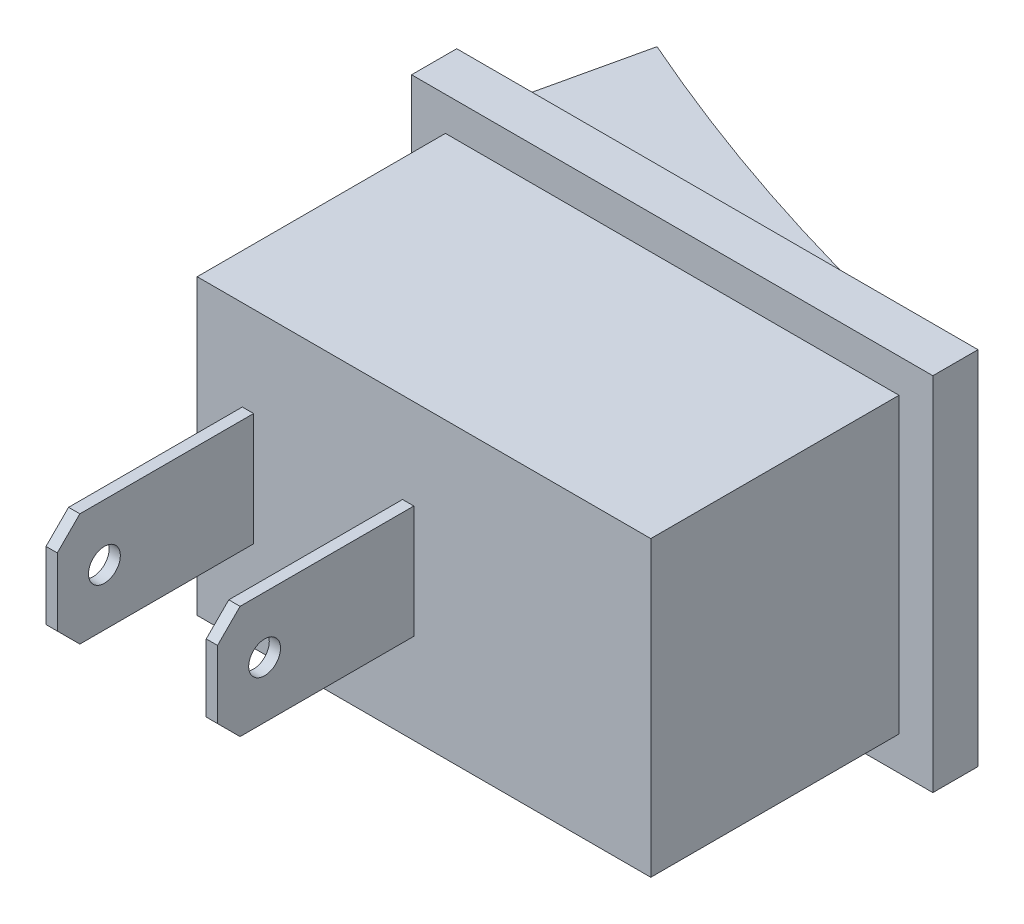
ISO-10303-21;
HEADER;
FILE_DESCRIPTION(('STEP AP214'),'2;1');
FILE_NAME('part.step','',(''),(''),'','','');
FILE_SCHEMA(('AUTOMOTIVE_DESIGN { 1 0 10303 214 1 1 1 1 }'));
ENDSEC;
DATA;
#1=APPLICATION_CONTEXT('core data for automotive mechanical design processes');
#2=APPLICATION_PROTOCOL_DEFINITION('international standard','automotive_design',2000,#1);
#3=PRODUCT_CONTEXT('',#1,'mechanical');
#4=PRODUCT('Part','Part','',(#3));
#5=PRODUCT_RELATED_PRODUCT_CATEGORY('part','',(#4));
#6=PRODUCT_DEFINITION_FORMATION('','',#4);
#7=PRODUCT_DEFINITION_CONTEXT('part definition',#1,'design');
#8=PRODUCT_DEFINITION('design','',#6,#7);
#9=PRODUCT_DEFINITION_SHAPE('','',#8);
#10=(LENGTH_UNIT() NAMED_UNIT(*) SI_UNIT(.MILLI.,.METRE.));
#11=(NAMED_UNIT(*) PLANE_ANGLE_UNIT() SI_UNIT($,.RADIAN.));
#12=(NAMED_UNIT(*) SI_UNIT($,.STERADIAN.) SOLID_ANGLE_UNIT());
#13=UNCERTAINTY_MEASURE_WITH_UNIT(LENGTH_MEASURE(1.E-05),#10,'distance_accuracy_value','');
#14=(GEOMETRIC_REPRESENTATION_CONTEXT(3) GLOBAL_UNCERTAINTY_ASSIGNED_CONTEXT((#13)) GLOBAL_UNIT_ASSIGNED_CONTEXT((#10,
#11,#12)) REPRESENTATION_CONTEXT('',''));
#15=CARTESIAN_POINT('',(0.,0.,0.));
#16=DIRECTION('',(0.,0.,1.));
#17=DIRECTION('',(1.,0.,0.));
#18=AXIS2_PLACEMENT_3D('',#15,#16,#17);
#19=CARTESIAN_POINT('',(0.,0.,11.));
#20=DIRECTION('',(1.,0.,0.));
#21=DIRECTION('',(0.,1.,0.));
#22=AXIS2_PLACEMENT_3D('',#19,#20,#21);
#23=PLANE('',#22);
#24=DIRECTION('',(0.,-1.,0.));
#25=VECTOR('',#24,1.);
#26=CARTESIAN_POINT('',(0.,0.,0.));
#27=LINE('',#26,#25);
#28=CARTESIAN_POINT('',(0.,0.,0.));
#29=VERTEX_POINT('',#28);
#30=CARTESIAN_POINT('',(0.,-13.,0.));
#31=VERTEX_POINT('',#30);
#32=EDGE_CURVE('E295',#29,#31,#27,.T.);
#33=ORIENTED_EDGE('',*,*,#32,.T.);
#34=DIRECTION('',(0.,0.,-1.));
#35=VECTOR('',#34,1.);
#36=CARTESIAN_POINT('',(0.,-13.,11.));
#37=LINE('',#36,#35);
#38=CARTESIAN_POINT('',(0.,-13.,11.));
#39=VERTEX_POINT('',#38);
#40=EDGE_CURVE('E349',#39,#31,#37,.T.);
#41=ORIENTED_EDGE('',*,*,#40,.F.);
#42=DIRECTION('',(0.,-1.,0.));
#43=VECTOR('',#42,1.);
#44=CARTESIAN_POINT('',(0.,0.,11.));
#45=LINE('',#44,#43);
#46=CARTESIAN_POINT('',(0.,0.,11.));
#47=VERTEX_POINT('',#46);
#48=EDGE_CURVE('E320',#47,#39,#45,.T.);
#49=ORIENTED_EDGE('',*,*,#48,.F.);
#50=DIRECTION('',(0.,0.,-1.));
#51=VECTOR('',#50,1.);
#52=CARTESIAN_POINT('',(0.,0.,11.));
#53=LINE('',#52,#51);
#54=EDGE_CURVE('E330',#47,#29,#53,.T.);
#55=ORIENTED_EDGE('',*,*,#54,.T.);
#56=EDGE_LOOP('',(#33,#41,#49,#55));
#57=FACE_BOUND('',#56,.T.);
#58=ADVANCED_FACE('F44',(#57),#23,.F.);
#59=CARTESIAN_POINT('',(0.,-13.,11.));
#60=DIRECTION('',(0.,1.,0.));
#61=DIRECTION('',(0.,0.,1.));
#62=AXIS2_PLACEMENT_3D('',#59,#60,#61);
#63=PLANE('',#62);
#64=DIRECTION('',(1.,0.,0.));
#65=VECTOR('',#64,1.);
#66=CARTESIAN_POINT('',(0.,-13.,0.));
#67=LINE('',#66,#65);
#68=CARTESIAN_POINT('',(20.1,-13.,0.));
#69=VERTEX_POINT('',#68);
#70=EDGE_CURVE('E333',#31,#69,#67,.T.);
#71=ORIENTED_EDGE('',*,*,#70,.T.);
#72=DIRECTION('',(0.,0.,-1.));
#73=VECTOR('',#72,1.);
#74=CARTESIAN_POINT('',(20.1,-13.,11.));
#75=LINE('',#74,#73);
#76=CARTESIAN_POINT('',(20.1,-13.,11.));
#77=VERTEX_POINT('',#76);
#78=EDGE_CURVE('E346',#77,#69,#75,.T.);
#79=ORIENTED_EDGE('',*,*,#78,.F.);
#80=DIRECTION('',(1.,0.,0.));
#81=VECTOR('',#80,1.);
#82=CARTESIAN_POINT('',(0.,-13.,11.));
#83=LINE('',#82,#81);
#84=EDGE_CURVE('E323',#39,#77,#83,.T.);
#85=ORIENTED_EDGE('',*,*,#84,.F.);
#86=ORIENTED_EDGE('',*,*,#40,.T.);
#87=EDGE_LOOP('',(#71,#79,#85,#86));
#88=FACE_BOUND('',#87,.T.);
#89=ADVANCED_FACE('F425',(#88),#63,.F.);
#90=CARTESIAN_POINT('',(20.1,0.,11.));
#91=DIRECTION('',(-1.,0.,0.));
#92=DIRECTION('',(0.,0.,1.));
#93=AXIS2_PLACEMENT_3D('',#90,#91,#92);
#94=PLANE('',#93);
#95=DIRECTION('',(0.,1.,0.));
#96=VECTOR('',#95,1.);
#97=CARTESIAN_POINT('',(20.1,0.,0.));
#98=LINE('',#97,#96);
#99=CARTESIAN_POINT('',(20.1,0.,0.));
#100=VERTEX_POINT('',#99);
#101=EDGE_CURVE('E336',#69,#100,#98,.T.);
#102=ORIENTED_EDGE('',*,*,#101,.T.);
#103=DIRECTION('',(0.,0.,-1.));
#104=VECTOR('',#103,1.);
#105=CARTESIAN_POINT('',(20.1,0.,11.));
#106=LINE('',#105,#104);
#107=CARTESIAN_POINT('',(20.1,0.,11.));
#108=VERTEX_POINT('',#107);
#109=EDGE_CURVE('E343',#108,#100,#106,.T.);
#110=ORIENTED_EDGE('',*,*,#109,.F.);
#111=DIRECTION('',(0.,1.,0.));
#112=VECTOR('',#111,1.);
#113=CARTESIAN_POINT('',(20.1,0.,11.));
#114=LINE('',#113,#112);
#115=EDGE_CURVE('E326',#77,#108,#114,.T.);
#116=ORIENTED_EDGE('',*,*,#115,.F.);
#117=ORIENTED_EDGE('',*,*,#78,.T.);
#118=EDGE_LOOP('',(#102,#110,#116,#117));
#119=FACE_BOUND('',#118,.T.);
#120=ADVANCED_FACE('F431',(#119),#94,.F.);
#121=CARTESIAN_POINT('',(0.,0.,11.));
#122=DIRECTION('',(0.,-1.,0.));
#123=DIRECTION('',(0.,0.,-1.));
#124=AXIS2_PLACEMENT_3D('',#121,#122,#123);
#125=PLANE('',#124);
#126=DIRECTION('',(-1.,0.,0.));
#127=VECTOR('',#126,1.);
#128=CARTESIAN_POINT('',(0.,0.,0.));
#129=LINE('',#128,#127);
#130=EDGE_CURVE('E324',#100,#29,#129,.T.);
#131=ORIENTED_EDGE('',*,*,#130,.T.);
#132=ORIENTED_EDGE('',*,*,#54,.F.);
#133=DIRECTION('',(-1.,0.,0.));
#134=VECTOR('',#133,1.);
#135=CARTESIAN_POINT('',(0.,0.,11.));
#136=LINE('',#135,#134);
#137=EDGE_CURVE('E328',#108,#47,#136,.T.);
#138=ORIENTED_EDGE('',*,*,#137,.F.);
#139=ORIENTED_EDGE('',*,*,#109,.T.);
#140=EDGE_LOOP('',(#131,#132,#138,#139));
#141=FACE_BOUND('',#140,.T.);
#142=ADVANCED_FACE('F497',(#141),#125,.F.);
#143=CARTESIAN_POINT('',(0.,0.,11.));
#144=DIRECTION('',(0.,0.,1.));
#145=DIRECTION('',(1.,0.,0.));
#146=AXIS2_PLACEMENT_3D('',#143,#144,#145);
#147=PLANE('',#146);
#148=DIRECTION('',(0.,-1.,0.));
#149=VECTOR('',#148,1.);
#150=CARTESIAN_POINT('',(2.5,0.,11.));
#151=LINE('',#150,#149);
#152=CARTESIAN_POINT('',(2.5,-4.,11.));
#153=VERTEX_POINT('',#152);
#154=CARTESIAN_POINT('',(2.5,-9.,11.));
#155=VERTEX_POINT('',#154);
#156=EDGE_CURVE('E276',#153,#155,#151,.T.);
#157=ORIENTED_EDGE('',*,*,#156,.T.);
#158=DIRECTION('',(1.,0.,0.));
#159=VECTOR('',#158,1.);
#160=CARTESIAN_POINT('',(0.,-9.,11.));
#161=LINE('',#160,#159);
#162=CARTESIAN_POINT('',(2.,-9.,11.));
#163=VERTEX_POINT('',#162);
#164=EDGE_CURVE('E272',#163,#155,#161,.T.);
#165=ORIENTED_EDGE('',*,*,#164,.F.);
#166=DIRECTION('',(0.,-1.,0.));
#167=VECTOR('',#166,1.);
#168=CARTESIAN_POINT('',(2.,0.,11.));
#169=LINE('',#168,#167);
#170=CARTESIAN_POINT('',(2.,-4.,11.));
#171=VERTEX_POINT('',#170);
#172=EDGE_CURVE('E283',#171,#163,#169,.T.);
#173=ORIENTED_EDGE('',*,*,#172,.F.);
#174=DIRECTION('',(1.,0.,0.));
#175=VECTOR('',#174,1.);
#176=CARTESIAN_POINT('',(0.,-4.,11.));
#177=LINE('',#176,#175);
#178=EDGE_CURVE('E279',#171,#153,#177,.T.);
#179=ORIENTED_EDGE('',*,*,#178,.T.);
#180=EDGE_LOOP('',(#157,#165,#173,#179));
#181=FACE_BOUND('',#180,.T.);
#182=DIRECTION('',(0.,-1.,0.));
#183=VECTOR('',#182,1.);
#184=CARTESIAN_POINT('',(9.6,0.,11.));
#185=LINE('',#184,#183);
#186=CARTESIAN_POINT('',(9.6,-4.,11.));
#187=VERTEX_POINT('',#186);
#188=CARTESIAN_POINT('',(9.6,-9.,11.));
#189=VERTEX_POINT('',#188);
#190=EDGE_CURVE('E267',#187,#189,#185,.T.);
#191=ORIENTED_EDGE('',*,*,#190,.T.);
#192=DIRECTION('',(-1.,0.,0.));
#193=VECTOR('',#192,1.);
#194=CARTESIAN_POINT('',(0.,-9.00000000000003,11.));
#195=LINE('',#194,#193);
#196=CARTESIAN_POINT('',(9.1,-9.,11.));
#197=VERTEX_POINT('',#196);
#198=EDGE_CURVE('E300',#189,#197,#195,.T.);
#199=ORIENTED_EDGE('',*,*,#198,.T.);
#200=DIRECTION('',(0.,-1.,0.));
#201=VECTOR('',#200,1.);
#202=CARTESIAN_POINT('',(9.1,0.,11.));
#203=LINE('',#202,#201);
#204=CARTESIAN_POINT('',(9.1,-4.,11.));
#205=VERTEX_POINT('',#204);
#206=EDGE_CURVE('E309',#205,#197,#203,.T.);
#207=ORIENTED_EDGE('',*,*,#206,.F.);
#208=DIRECTION('',(-1.,0.,0.));
#209=VECTOR('',#208,1.);
#210=CARTESIAN_POINT('',(0.,-4.00000000000002,11.));
#211=LINE('',#210,#209);
#212=EDGE_CURVE('E306',#187,#205,#211,.T.);
#213=ORIENTED_EDGE('',*,*,#212,.F.);
#214=EDGE_LOOP('',(#191,#199,#207,#213));
#215=FACE_BOUND('',#214,.T.);
#216=ORIENTED_EDGE('',*,*,#48,.T.);
#217=ORIENTED_EDGE('',*,*,#84,.T.);
#218=ORIENTED_EDGE('',*,*,#115,.T.);
#219=ORIENTED_EDGE('',*,*,#137,.T.);
#220=EDGE_LOOP('',(#216,#217,#218,#219));
#221=FACE_BOUND('',#220,.T.);
#222=ADVANCED_FACE('F405',(#181,#215,#221),#147,.T.);
#223=CARTESIAN_POINT('',(9.6,0.,19.7));
#224=DIRECTION('',(1.,0.,0.));
#225=DIRECTION('',(0.,0.,-1.));
#226=AXIS2_PLACEMENT_3D('',#223,#224,#225);
#227=PLANE('',#226);
#228=CARTESIAN_POINT('',(9.6,-6.5,17.6122146956072));
#229=DIRECTION('',(1.,0.,0.));
#230=DIRECTION('',(0.,0.,-1.));
#231=AXIS2_PLACEMENT_3D('',#228,#229,#230);
#232=CIRCLE('',#231,0.706106741558455);
#233=CARTESIAN_POINT('',(9.6,-6.5,16.9061079540488));
#234=VERTEX_POINT('',#233);
#235=EDGE_CURVE('E264',#234,#234,#232,.T.);
#236=ORIENTED_EDGE('',*,*,#235,.F.);
#237=EDGE_LOOP('',(#236));
#238=FACE_BOUND('',#237,.T.);
#239=DIRECTION('',(0.,-1.,0.));
#240=VECTOR('',#239,1.);
#241=CARTESIAN_POINT('',(9.6,0.,19.7));
#242=LINE('',#241,#240);
#243=CARTESIAN_POINT('',(9.6,-5.00000000000001,19.7));
#244=VERTEX_POINT('',#243);
#245=CARTESIAN_POINT('',(9.6,-7.99999999999999,19.7));
#246=VERTEX_POINT('',#245);
#247=EDGE_CURVE('E296',#244,#246,#242,.T.);
#248=ORIENTED_EDGE('',*,*,#247,.T.);
#249=DIRECTION('',(0.,0.707106781186549,0.707106781186546));
#250=VECTOR('',#249,1.);
#251=CARTESIAN_POINT('',(9.6,-3.99999999999998,23.7));
#252=LINE('',#251,#250);
#253=CARTESIAN_POINT('',(9.6,-9.,18.7));
#254=VERTEX_POINT('',#253);
#255=EDGE_CURVE('E366',#246,#254,#252,.F.);
#256=ORIENTED_EDGE('',*,*,#255,.T.);
#257=DIRECTION('',(0.,0.,-1.));
#258=VECTOR('',#257,1.);
#259=CARTESIAN_POINT('',(9.6,-9.,19.7));
#260=LINE('',#259,#258);
#261=EDGE_CURVE('E303',#254,#189,#260,.T.);
#262=ORIENTED_EDGE('',*,*,#261,.T.);
#263=ORIENTED_EDGE('',*,*,#190,.F.);
#264=DIRECTION('',(0.,0.,-1.));
#265=VECTOR('',#264,1.);
#266=CARTESIAN_POINT('',(9.6,-4.,19.7));
#267=LINE('',#266,#265);
#268=CARTESIAN_POINT('',(9.6,-4.,18.7));
#269=VERTEX_POINT('',#268);
#270=EDGE_CURVE('E280',#269,#187,#267,.T.);
#271=ORIENTED_EDGE('',*,*,#270,.F.);
#272=DIRECTION('',(0.,-0.707106781186546,0.707106781186549));
#273=VECTOR('',#272,1.);
#274=CARTESIAN_POINT('',(9.6,-2.50000000000001,17.2));
#275=LINE('',#274,#273);
#276=EDGE_CURVE('E364',#269,#244,#275,.T.);
#277=ORIENTED_EDGE('',*,*,#276,.T.);
#278=EDGE_LOOP('',(#248,#256,#262,#263,#271,#277));
#279=FACE_BOUND('',#278,.T.);
#280=ADVANCED_FACE('F462',(#238,#279),#227,.T.);
#281=CARTESIAN_POINT('',(0.,-4.00000000000002,19.7));
#282=DIRECTION('',(0.,-1.,0.));
#283=DIRECTION('',(1.,0.,0.));
#284=AXIS2_PLACEMENT_3D('',#281,#282,#283);
#285=PLANE('',#284);
#286=DIRECTION('',(0.,0.,-1.));
#287=VECTOR('',#286,1.);
#288=CARTESIAN_POINT('',(9.1,-4.,19.7));
#289=LINE('',#288,#287);
#290=CARTESIAN_POINT('',(9.1,-4.,18.7));
#291=VERTEX_POINT('',#290);
#292=EDGE_CURVE('E317',#291,#205,#289,.T.);
#293=ORIENTED_EDGE('',*,*,#292,.F.);
#294=DIRECTION('',(1.,0.,0.));
#295=VECTOR('',#294,1.);
#296=CARTESIAN_POINT('',(9.6,-4.,18.7));
#297=LINE('',#296,#295);
#298=EDGE_CURVE('E368',#291,#269,#297,.T.);
#299=ORIENTED_EDGE('',*,*,#298,.T.);
#300=ORIENTED_EDGE('',*,*,#270,.T.);
#301=ORIENTED_EDGE('',*,*,#212,.T.);
#302=EDGE_LOOP('',(#293,#299,#300,#301));
#303=FACE_BOUND('',#302,.T.);
#304=ADVANCED_FACE('F482',(#303),#285,.F.);
#305=CARTESIAN_POINT('',(9.1,0.,19.7));
#306=DIRECTION('',(1.,0.,0.));
#307=DIRECTION('',(0.,0.,-1.));
#308=AXIS2_PLACEMENT_3D('',#305,#306,#307);
#309=PLANE('',#308);
#310=CARTESIAN_POINT('',(9.1,-6.5,17.6122146956072));
#311=DIRECTION('',(1.,0.,0.));
#312=DIRECTION('',(0.,0.,-1.));
#313=AXIS2_PLACEMENT_3D('',#310,#311,#312);
#314=CIRCLE('',#313,0.706106741558455);
#315=CARTESIAN_POINT('',(9.1,-6.5,16.9061079540488));
#316=VERTEX_POINT('',#315);
#317=EDGE_CURVE('E261',#316,#316,#314,.T.);
#318=ORIENTED_EDGE('',*,*,#317,.T.);
#319=EDGE_LOOP('',(#318));
#320=FACE_BOUND('',#319,.T.);
#321=DIRECTION('',(0.,0.,-1.));
#322=VECTOR('',#321,1.);
#323=CARTESIAN_POINT('',(9.1,-9.,19.7));
#324=LINE('',#323,#322);
#325=CARTESIAN_POINT('',(9.1,-9.,18.7));
#326=VERTEX_POINT('',#325);
#327=EDGE_CURVE('E315',#326,#197,#324,.T.);
#328=ORIENTED_EDGE('',*,*,#327,.F.);
#329=DIRECTION('',(0.,-0.707106781186549,-0.707106781186546));
#330=VECTOR('',#329,1.);
#331=CARTESIAN_POINT('',(9.1,-9.00000000000001,18.7));
#332=LINE('',#331,#330);
#333=CARTESIAN_POINT('',(9.1,-7.99999999999999,19.7));
#334=VERTEX_POINT('',#333);
#335=EDGE_CURVE('E357',#326,#334,#332,.F.);
#336=ORIENTED_EDGE('',*,*,#335,.T.);
#337=DIRECTION('',(0.,-1.,0.));
#338=VECTOR('',#337,1.);
#339=CARTESIAN_POINT('',(9.1,0.,19.7));
#340=LINE('',#339,#338);
#341=CARTESIAN_POINT('',(9.1,-5.00000000000001,19.7));
#342=VERTEX_POINT('',#341);
#343=EDGE_CURVE('E299',#342,#334,#340,.T.);
#344=ORIENTED_EDGE('',*,*,#343,.F.);
#345=DIRECTION('',(0.,0.707106781186546,-0.707106781186549));
#346=VECTOR('',#345,1.);
#347=CARTESIAN_POINT('',(9.1,-5.00000000000002,19.7));
#348=LINE('',#347,#346);
#349=EDGE_CURVE('E355',#342,#291,#348,.T.);
#350=ORIENTED_EDGE('',*,*,#349,.T.);
#351=ORIENTED_EDGE('',*,*,#292,.T.);
#352=ORIENTED_EDGE('',*,*,#206,.T.);
#353=EDGE_LOOP('',(#328,#336,#344,#350,#351,#352));
#354=FACE_BOUND('',#353,.T.);
#355=ADVANCED_FACE('F479',(#320,#354),#309,.F.);
#356=CARTESIAN_POINT('',(0.,-9.00000000000003,19.7));
#357=DIRECTION('',(0.,-1.,0.));
#358=DIRECTION('',(1.,0.,0.));
#359=AXIS2_PLACEMENT_3D('',#356,#357,#358);
#360=PLANE('',#359);
#361=ORIENTED_EDGE('',*,*,#261,.F.);
#362=DIRECTION('',(-1.,0.,0.));
#363=VECTOR('',#362,1.);
#364=CARTESIAN_POINT('',(0.,-9.00000000000003,18.7));
#365=LINE('',#364,#363);
#366=EDGE_CURVE('E352',#254,#326,#365,.T.);
#367=ORIENTED_EDGE('',*,*,#366,.T.);
#368=ORIENTED_EDGE('',*,*,#327,.T.);
#369=ORIENTED_EDGE('',*,*,#198,.F.);
#370=EDGE_LOOP('',(#361,#367,#368,#369));
#371=FACE_BOUND('',#370,.T.);
#372=ADVANCED_FACE('F473',(#371),#360,.T.);
#373=CARTESIAN_POINT('',(0.,0.,19.7));
#374=DIRECTION('',(0.,0.,1.));
#375=DIRECTION('',(1.,0.,0.));
#376=AXIS2_PLACEMENT_3D('',#373,#374,#375);
#377=PLANE('',#376);
#378=ORIENTED_EDGE('',*,*,#343,.T.);
#379=DIRECTION('',(1.,0.,0.));
#380=VECTOR('',#379,1.);
#381=CARTESIAN_POINT('',(0.,-8.00000000000002,19.7));
#382=LINE('',#381,#380);
#383=EDGE_CURVE('E362',#334,#246,#382,.T.);
#384=ORIENTED_EDGE('',*,*,#383,.T.);
#385=ORIENTED_EDGE('',*,*,#247,.F.);
#386=DIRECTION('',(-1.,0.,0.));
#387=VECTOR('',#386,1.);
#388=CARTESIAN_POINT('',(9.1,-5.00000000000001,19.7));
#389=LINE('',#388,#387);
#390=EDGE_CURVE('E359',#244,#342,#389,.T.);
#391=ORIENTED_EDGE('',*,*,#390,.T.);
#392=EDGE_LOOP('',(#378,#384,#385,#391));
#393=FACE_BOUND('',#392,.T.);
#394=ADVANCED_FACE('F466',(#393),#377,.T.);
#395=CARTESIAN_POINT('',(2.5,0.,19.7));
#396=DIRECTION('',(1.,0.,0.));
#397=DIRECTION('',(0.,0.,-1.));
#398=AXIS2_PLACEMENT_3D('',#395,#396,#397);
#399=PLANE('',#398);
#400=CARTESIAN_POINT('',(2.5,-6.5,17.6122146956072));
#401=DIRECTION('',(1.,0.,0.));
#402=DIRECTION('',(0.,0.,-1.));
#403=AXIS2_PLACEMENT_3D('',#400,#401,#402);
#404=CIRCLE('',#403,0.706106741558455);
#405=CARTESIAN_POINT('',(2.5,-6.5,16.9061079540488));
#406=VERTEX_POINT('',#405);
#407=EDGE_CURVE('E258',#406,#406,#404,.T.);
#408=ORIENTED_EDGE('',*,*,#407,.F.);
#409=EDGE_LOOP('',(#408));
#410=FACE_BOUND('',#409,.T.);
#411=DIRECTION('',(0.,-1.,0.));
#412=VECTOR('',#411,1.);
#413=CARTESIAN_POINT('',(2.5,0.,19.7));
#414=LINE('',#413,#412);
#415=CARTESIAN_POINT('',(2.5,-5.00000000000001,19.7));
#416=VERTEX_POINT('',#415);
#417=CARTESIAN_POINT('',(2.5,-7.99999999999999,19.7));
#418=VERTEX_POINT('',#417);
#419=EDGE_CURVE('E268',#416,#418,#414,.T.);
#420=ORIENTED_EDGE('',*,*,#419,.T.);
#421=DIRECTION('',(0.,-0.707106781186546,-0.707106781186549));
#422=VECTOR('',#421,1.);
#423=CARTESIAN_POINT('',(2.5,-4.00000000000001,23.7));
#424=LINE('',#423,#422);
#425=CARTESIAN_POINT('',(2.5,-9.,18.7));
#426=VERTEX_POINT('',#425);
#427=EDGE_CURVE('E377',#418,#426,#424,.T.);
#428=ORIENTED_EDGE('',*,*,#427,.T.);
#429=DIRECTION('',(0.,0.,-1.));
#430=VECTOR('',#429,1.);
#431=CARTESIAN_POINT('',(2.5,-9.,19.7));
#432=LINE('',#431,#430);
#433=EDGE_CURVE('E275',#426,#155,#432,.T.);
#434=ORIENTED_EDGE('',*,*,#433,.T.);
#435=ORIENTED_EDGE('',*,*,#156,.F.);
#436=DIRECTION('',(0.,0.,-1.));
#437=VECTOR('',#436,1.);
#438=CARTESIAN_POINT('',(2.5,-4.,19.7));
#439=LINE('',#438,#437);
#440=CARTESIAN_POINT('',(2.5,-4.,18.7));
#441=VERTEX_POINT('',#440);
#442=EDGE_CURVE('E293',#441,#153,#439,.T.);
#443=ORIENTED_EDGE('',*,*,#442,.F.);
#444=DIRECTION('',(0.,0.707106781186549,-0.707106781186546));
#445=VECTOR('',#444,1.);
#446=CARTESIAN_POINT('',(2.5,-2.5,17.2));
#447=LINE('',#446,#445);
#448=EDGE_CURVE('E375',#441,#416,#447,.F.);
#449=ORIENTED_EDGE('',*,*,#448,.T.);
#450=EDGE_LOOP('',(#420,#428,#434,#435,#443,#449));
#451=FACE_BOUND('',#450,.T.);
#452=ADVANCED_FACE('F398',(#410,#451),#399,.T.);
#453=CARTESIAN_POINT('',(0.,-4.,19.7));
#454=DIRECTION('',(0.,1.,0.));
#455=DIRECTION('',(0.,0.,1.));
#456=AXIS2_PLACEMENT_3D('',#453,#454,#455);
#457=PLANE('',#456);
#458=DIRECTION('',(0.,0.,-1.));
#459=VECTOR('',#458,1.);
#460=CARTESIAN_POINT('',(2.,-4.,19.7));
#461=LINE('',#460,#459);
#462=CARTESIAN_POINT('',(2.,-4.,18.7));
#463=VERTEX_POINT('',#462);
#464=EDGE_CURVE('E291',#463,#171,#461,.T.);
#465=ORIENTED_EDGE('',*,*,#464,.F.);
#466=DIRECTION('',(1.,0.,0.));
#467=VECTOR('',#466,1.);
#468=CARTESIAN_POINT('',(0.,-4.,18.7));
#469=LINE('',#468,#467);
#470=EDGE_CURVE('E11',#463,#441,#469,.T.);
#471=ORIENTED_EDGE('',*,*,#470,.T.);
#472=ORIENTED_EDGE('',*,*,#442,.T.);
#473=ORIENTED_EDGE('',*,*,#178,.F.);
#474=EDGE_LOOP('',(#465,#471,#472,#473));
#475=FACE_BOUND('',#474,.T.);
#476=ADVANCED_FACE('F411',(#475),#457,.T.);
#477=CARTESIAN_POINT('',(2.,0.,19.7));
#478=DIRECTION('',(1.,0.,0.));
#479=DIRECTION('',(0.,0.,-1.));
#480=AXIS2_PLACEMENT_3D('',#477,#478,#479);
#481=PLANE('',#480);
#482=CARTESIAN_POINT('',(2.,-6.5,17.6122146956072));
#483=DIRECTION('',(-1.,0.,0.));
#484=DIRECTION('',(0.,0.,1.));
#485=AXIS2_PLACEMENT_3D('',#482,#483,#484);
#486=CIRCLE('',#485,0.706106741558455);
#487=CARTESIAN_POINT('',(2.,-6.5,18.3183214371657));
#488=VERTEX_POINT('',#487);
#489=EDGE_CURVE('E255',#488,#488,#486,.T.);
#490=ORIENTED_EDGE('',*,*,#489,.F.);
#491=EDGE_LOOP('',(#490));
#492=FACE_BOUND('',#491,.T.);
#493=DIRECTION('',(0.,0.,-1.));
#494=VECTOR('',#493,1.);
#495=CARTESIAN_POINT('',(2.,-9.,19.7));
#496=LINE('',#495,#494);
#497=CARTESIAN_POINT('',(2.,-9.,18.7));
#498=VERTEX_POINT('',#497);
#499=EDGE_CURVE('E289',#498,#163,#496,.T.);
#500=ORIENTED_EDGE('',*,*,#499,.F.);
#501=DIRECTION('',(0.,0.707106781186546,0.707106781186549));
#502=VECTOR('',#501,1.);
#503=CARTESIAN_POINT('',(2.,-7.99999999999999,19.7));
#504=LINE('',#503,#502);
#505=CARTESIAN_POINT('',(2.,-7.99999999999999,19.7));
#506=VERTEX_POINT('',#505);
#507=EDGE_CURVE('E53',#498,#506,#504,.T.);
#508=ORIENTED_EDGE('',*,*,#507,.T.);
#509=DIRECTION('',(0.,-1.,0.));
#510=VECTOR('',#509,1.);
#511=CARTESIAN_POINT('',(2.,0.,19.7));
#512=LINE('',#511,#510);
#513=CARTESIAN_POINT('',(2.,-5.00000000000001,19.7));
#514=VERTEX_POINT('',#513);
#515=EDGE_CURVE('E271',#514,#506,#512,.T.);
#516=ORIENTED_EDGE('',*,*,#515,.F.);
#517=DIRECTION('',(0.,-0.707106781186549,0.707106781186546));
#518=VECTOR('',#517,1.);
#519=CARTESIAN_POINT('',(2.,-4.,18.7));
#520=LINE('',#519,#518);
#521=EDGE_CURVE('E381',#514,#463,#520,.F.);
#522=ORIENTED_EDGE('',*,*,#521,.T.);
#523=ORIENTED_EDGE('',*,*,#464,.T.);
#524=ORIENTED_EDGE('',*,*,#172,.T.);
#525=EDGE_LOOP('',(#500,#508,#516,#522,#523,#524));
#526=FACE_BOUND('',#525,.T.);
#527=ADVANCED_FACE('F386',(#492,#526),#481,.F.);
#528=CARTESIAN_POINT('',(0.,-9.,19.7));
#529=DIRECTION('',(0.,1.,0.));
#530=DIRECTION('',(0.,0.,1.));
#531=AXIS2_PLACEMENT_3D('',#528,#529,#530);
#532=PLANE('',#531);
#533=ORIENTED_EDGE('',*,*,#433,.F.);
#534=DIRECTION('',(-1.,0.,0.));
#535=VECTOR('',#534,1.);
#536=CARTESIAN_POINT('',(2.,-9.,18.7));
#537=LINE('',#536,#535);
#538=EDGE_CURVE('E379',#426,#498,#537,.T.);
#539=ORIENTED_EDGE('',*,*,#538,.T.);
#540=ORIENTED_EDGE('',*,*,#499,.T.);
#541=ORIENTED_EDGE('',*,*,#164,.T.);
#542=EDGE_LOOP('',(#533,#539,#540,#541));
#543=FACE_BOUND('',#542,.T.);
#544=ADVANCED_FACE('F401',(#543),#532,.F.);
#545=CARTESIAN_POINT('',(0.,0.,19.7));
#546=DIRECTION('',(0.,0.,1.));
#547=DIRECTION('',(1.,0.,0.));
#548=AXIS2_PLACEMENT_3D('',#545,#546,#547);
#549=PLANE('',#548);
#550=ORIENTED_EDGE('',*,*,#515,.T.);
#551=DIRECTION('',(1.,0.,0.));
#552=VECTOR('',#551,1.);
#553=CARTESIAN_POINT('',(2.5,-7.99999999999999,19.7));
#554=LINE('',#553,#552);
#555=EDGE_CURVE('E372',#506,#418,#554,.T.);
#556=ORIENTED_EDGE('',*,*,#555,.T.);
#557=ORIENTED_EDGE('',*,*,#419,.F.);
#558=DIRECTION('',(-1.,0.,0.));
#559=VECTOR('',#558,1.);
#560=CARTESIAN_POINT('',(0.,-5.00000000000001,19.7));
#561=LINE('',#560,#559);
#562=EDGE_CURVE('E370',#416,#514,#561,.T.);
#563=ORIENTED_EDGE('',*,*,#562,.T.);
#564=EDGE_LOOP('',(#550,#556,#557,#563));
#565=FACE_BOUND('',#564,.T.);
#566=ADVANCED_FACE('F392',(#565),#549,.T.);
#567=CARTESIAN_POINT('',(10.7,-6.5,17.6122146956072));
#568=DIRECTION('',(-1.,0.,0.));
#569=DIRECTION('',(0.,0.,1.));
#570=AXIS2_PLACEMENT_3D('',#567,#568,#569);
#571=CYLINDRICAL_SURFACE('',#570,0.706106741558455);
#572=ORIENTED_EDGE('',*,*,#407,.T.);
#573=EDGE_LOOP('',(#572));
#574=FACE_BOUND('',#573,.T.);
#575=ORIENTED_EDGE('',*,*,#489,.T.);
#576=EDGE_LOOP('',(#575));
#577=FACE_BOUND('',#576,.T.);
#578=ADVANCED_FACE('F547',(#574,#577),#571,.F.);
#579=ORIENTED_EDGE('',*,*,#235,.T.);
#580=EDGE_LOOP('',(#579));
#581=FACE_BOUND('',#580,.T.);
#582=ORIENTED_EDGE('',*,*,#317,.F.);
#583=EDGE_LOOP('',(#582));
#584=FACE_BOUND('',#583,.T.);
#585=ADVANCED_FACE('F443',(#581,#584),#571,.F.);
#586=CARTESIAN_POINT('',(0.,-9.00000000000003,18.7));
#587=DIRECTION('',(0.,0.707106781186546,-0.707106781186549));
#588=DIRECTION('',(-1.,0.,0.));
#589=AXIS2_PLACEMENT_3D('',#586,#587,#588);
#590=PLANE('',#589);
#591=ORIENTED_EDGE('',*,*,#255,.F.);
#592=ORIENTED_EDGE('',*,*,#383,.F.);
#593=ORIENTED_EDGE('',*,*,#335,.F.);
#594=ORIENTED_EDGE('',*,*,#366,.F.);
#595=EDGE_LOOP('',(#591,#592,#593,#594));
#596=FACE_BOUND('',#595,.T.);
#597=ADVANCED_FACE('F437',(#596),#590,.F.);
#598=CARTESIAN_POINT('',(0.,-5.00000000000002,19.7));
#599=DIRECTION('',(0.,0.707106781186549,0.707106781186546));
#600=DIRECTION('',(1.,0.,0.));
#601=AXIS2_PLACEMENT_3D('',#598,#599,#600);
#602=PLANE('',#601);
#603=ORIENTED_EDGE('',*,*,#276,.F.);
#604=ORIENTED_EDGE('',*,*,#298,.F.);
#605=ORIENTED_EDGE('',*,*,#349,.F.);
#606=ORIENTED_EDGE('',*,*,#390,.F.);
#607=EDGE_LOOP('',(#603,#604,#605,#606));
#608=FACE_BOUND('',#607,.T.);
#609=ADVANCED_FACE('F424',(#608),#602,.T.);
#610=CARTESIAN_POINT('',(0.,-7.99999999999999,19.7));
#611=DIRECTION('',(0.,-0.707106781186549,0.707106781186546));
#612=DIRECTION('',(-1.,0.,0.));
#613=AXIS2_PLACEMENT_3D('',#610,#611,#612);
#614=PLANE('',#613);
#615=ORIENTED_EDGE('',*,*,#507,.F.);
#616=ORIENTED_EDGE('',*,*,#538,.F.);
#617=ORIENTED_EDGE('',*,*,#427,.F.);
#618=ORIENTED_EDGE('',*,*,#555,.F.);
#619=EDGE_LOOP('',(#615,#616,#617,#618));
#620=FACE_BOUND('',#619,.T.);
#621=ADVANCED_FACE('F395',(#620),#614,.T.);
#622=CARTESIAN_POINT('',(0.,-4.,18.7));
#623=DIRECTION('',(0.,-0.707106781186546,-0.707106781186549));
#624=DIRECTION('',(1.,0.,0.));
#625=AXIS2_PLACEMENT_3D('',#622,#623,#624);
#626=PLANE('',#625);
#627=ORIENTED_EDGE('',*,*,#521,.F.);
#628=ORIENTED_EDGE('',*,*,#562,.F.);
#629=ORIENTED_EDGE('',*,*,#448,.F.);
#630=ORIENTED_EDGE('',*,*,#470,.F.);
#631=EDGE_LOOP('',(#627,#628,#629,#630));
#632=FACE_BOUND('',#631,.T.);
#633=ADVANCED_FACE('F47',(#632),#626,.F.);
#634=CARTESIAN_POINT('',(21.6,-14.5,-2.));
#635=DIRECTION('',(0.,1.,0.));
#636=DIRECTION('',(0.,0.,1.));
#637=AXIS2_PLACEMENT_3D('',#634,#635,#636);
#638=PLANE('',#637);
#639=DIRECTION('',(-1.,0.,0.));
#640=VECTOR('',#639,1.);
#641=CARTESIAN_POINT('',(21.6,-14.5,0.));
#642=LINE('',#641,#640);
#643=CARTESIAN_POINT('',(21.6,-14.5,0.));
#644=VERTEX_POINT('',#643);
#645=CARTESIAN_POINT('',(-1.5,-14.5,0.));
#646=VERTEX_POINT('',#645);
#647=EDGE_CURVE('E225',#644,#646,#642,.T.);
#648=ORIENTED_EDGE('',*,*,#647,.T.);
#649=DIRECTION('',(0.,0.,1.));
#650=VECTOR('',#649,1.);
#651=CARTESIAN_POINT('',(-1.5,-14.5,-2.));
#652=LINE('',#651,#650);
#653=CARTESIAN_POINT('',(-1.5,-14.5,-2.));
#654=VERTEX_POINT('',#653);
#655=EDGE_CURVE('E252',#654,#646,#652,.T.);
#656=ORIENTED_EDGE('',*,*,#655,.F.);
#657=DIRECTION('',(-1.,0.,0.));
#658=VECTOR('',#657,1.);
#659=CARTESIAN_POINT('',(21.6,-14.5,-2.));
#660=LINE('',#659,#658);
#661=CARTESIAN_POINT('',(21.6,-14.5,-2.));
#662=VERTEX_POINT('',#661);
#663=EDGE_CURVE('E226',#662,#654,#660,.T.);
#664=ORIENTED_EDGE('',*,*,#663,.F.);
#665=DIRECTION('',(0.,0.,1.));
#666=VECTOR('',#665,1.);
#667=CARTESIAN_POINT('',(21.6,-14.5,-2.));
#668=LINE('',#667,#666);
#669=EDGE_CURVE('E236',#662,#644,#668,.T.);
#670=ORIENTED_EDGE('',*,*,#669,.T.);
#671=EDGE_LOOP('',(#648,#656,#664,#670));
#672=FACE_BOUND('',#671,.T.);
#673=ADVANCED_FACE('F415',(#672),#638,.F.);
#674=CARTESIAN_POINT('',(-1.5,-14.5,-2.));
#675=DIRECTION('',(1.,0.,0.));
#676=DIRECTION('',(0.,1.,0.));
#677=AXIS2_PLACEMENT_3D('',#674,#675,#676);
#678=PLANE('',#677);
#679=DIRECTION('',(0.,1.,0.));
#680=VECTOR('',#679,1.);
#681=CARTESIAN_POINT('',(-1.5,-14.5,0.));
#682=LINE('',#681,#680);
#683=CARTESIAN_POINT('',(-1.5,1.5,0.));
#684=VERTEX_POINT('',#683);
#685=EDGE_CURVE('E239',#646,#684,#682,.T.);
#686=ORIENTED_EDGE('',*,*,#685,.T.);
#687=DIRECTION('',(0.,0.,1.));
#688=VECTOR('',#687,1.);
#689=CARTESIAN_POINT('',(-1.5,1.5,-2.));
#690=LINE('',#689,#688);
#691=CARTESIAN_POINT('',(-1.5,1.5,-2.));
#692=VERTEX_POINT('',#691);
#693=EDGE_CURVE('E249',#692,#684,#690,.T.);
#694=ORIENTED_EDGE('',*,*,#693,.F.);
#695=DIRECTION('',(0.,1.,0.));
#696=VECTOR('',#695,1.);
#697=CARTESIAN_POINT('',(-1.5,-14.5,-2.));
#698=LINE('',#697,#696);
#699=EDGE_CURVE('E229',#654,#692,#698,.T.);
#700=ORIENTED_EDGE('',*,*,#699,.F.);
#701=ORIENTED_EDGE('',*,*,#655,.T.);
#702=EDGE_LOOP('',(#686,#694,#700,#701));
#703=FACE_BOUND('',#702,.T.);
#704=ADVANCED_FACE('F421',(#703),#678,.F.);
#705=CARTESIAN_POINT('',(-1.5,1.5,-2.));
#706=DIRECTION('',(0.,-1.,0.));
#707=DIRECTION('',(0.,0.,-1.));
#708=AXIS2_PLACEMENT_3D('',#705,#706,#707);
#709=PLANE('',#708);
#710=DIRECTION('',(1.,0.,0.));
#711=VECTOR('',#710,1.);
#712=CARTESIAN_POINT('',(-1.5,1.5,0.));
#713=LINE('',#712,#711);
#714=CARTESIAN_POINT('',(21.6,1.5,0.));
#715=VERTEX_POINT('',#714);
#716=EDGE_CURVE('E241',#684,#715,#713,.T.);
#717=ORIENTED_EDGE('',*,*,#716,.T.);
#718=DIRECTION('',(0.,0.,1.));
#719=VECTOR('',#718,1.);
#720=CARTESIAN_POINT('',(21.6,1.5,-2.));
#721=LINE('',#720,#719);
#722=CARTESIAN_POINT('',(21.6,1.5,-2.));
#723=VERTEX_POINT('',#722);
#724=EDGE_CURVE('E246',#723,#715,#721,.T.);
#725=ORIENTED_EDGE('',*,*,#724,.F.);
#726=DIRECTION('',(1.,0.,0.));
#727=VECTOR('',#726,1.);
#728=CARTESIAN_POINT('',(-1.5,1.5,-2.));
#729=LINE('',#728,#727);
#730=EDGE_CURVE('E232',#692,#723,#729,.T.);
#731=ORIENTED_EDGE('',*,*,#730,.F.);
#732=ORIENTED_EDGE('',*,*,#693,.T.);
#733=EDGE_LOOP('',(#717,#725,#731,#732));
#734=FACE_BOUND('',#733,.T.);
#735=ADVANCED_FACE('F529',(#734),#709,.F.);
#736=CARTESIAN_POINT('',(21.6,1.5,-2.));
#737=DIRECTION('',(-1.,0.,0.));
#738=DIRECTION('',(0.,0.,1.));
#739=AXIS2_PLACEMENT_3D('',#736,#737,#738);
#740=PLANE('',#739);
#741=DIRECTION('',(0.,-1.,0.));
#742=VECTOR('',#741,1.);
#743=CARTESIAN_POINT('',(21.6,1.5,0.));
#744=LINE('',#743,#742);
#745=EDGE_CURVE('E230',#715,#644,#744,.T.);
#746=ORIENTED_EDGE('',*,*,#745,.T.);
#747=ORIENTED_EDGE('',*,*,#669,.F.);
#748=DIRECTION('',(0.,-1.,0.));
#749=VECTOR('',#748,1.);
#750=CARTESIAN_POINT('',(21.6,1.5,-2.));
#751=LINE('',#750,#749);
#752=EDGE_CURVE('E234',#723,#662,#751,.T.);
#753=ORIENTED_EDGE('',*,*,#752,.F.);
#754=ORIENTED_EDGE('',*,*,#724,.T.);
#755=EDGE_LOOP('',(#746,#747,#753,#754));
#756=FACE_BOUND('',#755,.T.);
#757=ADVANCED_FACE('F525',(#756),#740,.F.);
#758=CARTESIAN_POINT('',(0.,0.,-2.));
#759=DIRECTION('',(0.,0.,-1.));
#760=DIRECTION('',(-1.,0.,0.));
#761=AXIS2_PLACEMENT_3D('',#758,#759,#760);
#762=PLANE('',#761);
#763=DIRECTION('',(-1.,0.,0.));
#764=VECTOR('',#763,1.);
#765=CARTESIAN_POINT('',(0.,-13.,-2.));
#766=LINE('',#765,#764);
#767=CARTESIAN_POINT('',(20.1,-13.,-2.));
#768=VERTEX_POINT('',#767);
#769=CARTESIAN_POINT('',(0.,-13.,-2.));
#770=VERTEX_POINT('',#769);
#771=EDGE_CURVE('E60',#768,#770,#766,.T.);
#772=ORIENTED_EDGE('',*,*,#771,.F.);
#773=DIRECTION('',(0.,1.,0.));
#774=VECTOR('',#773,1.);
#775=CARTESIAN_POINT('',(20.1,-33.981183613591,-2.));
#776=LINE('',#775,#774);
#777=CARTESIAN_POINT('',(20.1,0.,-2.));
#778=VERTEX_POINT('',#777);
#779=EDGE_CURVE('E65',#768,#778,#776,.T.);
#780=ORIENTED_EDGE('',*,*,#779,.T.);
#781=DIRECTION('',(1.,0.,0.));
#782=VECTOR('',#781,1.);
#783=CARTESIAN_POINT('',(0.,0.,-2.));
#784=LINE('',#783,#782);
#785=CARTESIAN_POINT('',(0.,0.,-2.));
#786=VERTEX_POINT('',#785);
#787=EDGE_CURVE('E214',#786,#778,#784,.T.);
#788=ORIENTED_EDGE('',*,*,#787,.F.);
#789=DIRECTION('',(0.,1.,0.));
#790=VECTOR('',#789,1.);
#791=CARTESIAN_POINT('',(0.,-33.981183613591,-2.));
#792=LINE('',#791,#790);
#793=EDGE_CURVE('E208',#770,#786,#792,.T.);
#794=ORIENTED_EDGE('',*,*,#793,.F.);
#795=EDGE_LOOP('',(#772,#780,#788,#794));
#796=FACE_BOUND('',#795,.T.);
#797=ORIENTED_EDGE('',*,*,#663,.T.);
#798=ORIENTED_EDGE('',*,*,#699,.T.);
#799=ORIENTED_EDGE('',*,*,#730,.T.);
#800=ORIENTED_EDGE('',*,*,#752,.T.);
#801=EDGE_LOOP('',(#797,#798,#799,#800));
#802=FACE_BOUND('',#801,.T.);
#803=ADVANCED_FACE('F515',(#796,#802),#762,.T.);
#804=CARTESIAN_POINT('',(0.,0.,0.));
#805=DIRECTION('',(0.,0.,-1.));
#806=DIRECTION('',(-1.,0.,0.));
#807=AXIS2_PLACEMENT_3D('',#804,#805,#806);
#808=PLANE('',#807);
#809=ORIENTED_EDGE('',*,*,#32,.F.);
#810=ORIENTED_EDGE('',*,*,#130,.F.);
#811=ORIENTED_EDGE('',*,*,#101,.F.);
#812=ORIENTED_EDGE('',*,*,#70,.F.);
#813=EDGE_LOOP('',(#809,#810,#811,#812));
#814=FACE_BOUND('',#813,.T.);
#815=ORIENTED_EDGE('',*,*,#647,.F.);
#816=ORIENTED_EDGE('',*,*,#745,.F.);
#817=ORIENTED_EDGE('',*,*,#716,.F.);
#818=ORIENTED_EDGE('',*,*,#685,.F.);
#819=EDGE_LOOP('',(#815,#816,#817,#818));
#820=FACE_BOUND('',#819,.T.);
#821=ADVANCED_FACE('F512',(#814,#820),#808,.F.);
#822=CARTESIAN_POINT('',(0.,-33.981183613591,-2.));
#823=DIRECTION('',(-0.975356033456554,0.,-0.220636823762258));
#824=DIRECTION('',(-0.220636823762258,0.,0.975356033456554));
#825=AXIS2_PLACEMENT_3D('',#822,#823,#824);
#826=PLANE('',#825);
#827=DIRECTION('',(0.220636823762258,0.,-0.975356033456554));
#828=VECTOR('',#827,1.);
#829=CARTESIAN_POINT('',(0.,-13.,-2.));
#830=LINE('',#829,#828);
#831=CARTESIAN_POINT('',(1.36103565386916,-13.,-8.01664905302112));
#832=VERTEX_POINT('',#831);
#833=EDGE_CURVE('E222',#770,#832,#830,.T.);
#834=ORIENTED_EDGE('',*,*,#833,.F.);
#835=ORIENTED_EDGE('',*,*,#793,.T.);
#836=DIRECTION('',(-0.220636823762258,0.,0.975356033456554));
#837=VECTOR('',#836,1.);
#838=CARTESIAN_POINT('',(0.,0.,-2.));
#839=LINE('',#838,#837);
#840=CARTESIAN_POINT('',(1.36103565386916,0.,-8.01664905302112));
#841=VERTEX_POINT('',#840);
#842=EDGE_CURVE('E213',#841,#786,#839,.T.);
#843=ORIENTED_EDGE('',*,*,#842,.F.);
#844=DIRECTION('',(0.,1.,0.));
#845=VECTOR('',#844,1.);
#846=CARTESIAN_POINT('',(1.36103565386916,-33.981183613591,-8.01664905302112));
#847=LINE('',#846,#845);
#848=EDGE_CURVE('E199',#832,#841,#847,.T.);
#849=ORIENTED_EDGE('',*,*,#848,.F.);
#850=EDGE_LOOP('',(#834,#835,#843,#849));
#851=FACE_BOUND('',#850,.T.);
#852=ADVANCED_FACE('F217',(#851),#826,.T.);
#853=CARTESIAN_POINT('',(39.9491220694585,-33.981183613591,-96.010205859349));
#854=DIRECTION('',(0.,1.,0.));
#855=DIRECTION('',(0.,0.,1.));
#856=AXIS2_PLACEMENT_3D('',#853,#854,#855);
#857=CYLINDRICAL_SURFACE('',#856,96.0828103910655);
#858=CARTESIAN_POINT('',(39.9491220694585,-13.,-96.010205859349));
#859=DIRECTION('',(0.,1.,0.));
#860=DIRECTION('',(0.,0.,1.));
#861=AXIS2_PLACEMENT_3D('',#858,#859,#860);
#862=CIRCLE('',#861,96.0828103910655);
#863=EDGE_CURVE('E204',#832,#768,#862,.T.);
#864=ORIENTED_EDGE('',*,*,#863,.F.);
#865=ORIENTED_EDGE('',*,*,#848,.T.);
#866=CARTESIAN_POINT('',(39.9491220694585,0.,-96.010205859349));
#867=DIRECTION('',(0.,-1.,0.));
#868=DIRECTION('',(0.,0.,1.));
#869=AXIS2_PLACEMENT_3D('',#866,#867,#868);
#870=CIRCLE('',#869,96.0828103910655);
#871=EDGE_CURVE('E202',#778,#841,#870,.T.);
#872=ORIENTED_EDGE('',*,*,#871,.F.);
#873=ORIENTED_EDGE('',*,*,#779,.F.);
#874=EDGE_LOOP('',(#864,#865,#872,#873));
#875=FACE_BOUND('',#874,.T.);
#876=ADVANCED_FACE('F201',(#875),#857,.F.);
#877=CARTESIAN_POINT('',(39.9491220694585,0.,-96.010205859349));
#878=DIRECTION('',(0.,1.,0.));
#879=DIRECTION('',(0.,0.,1.));
#880=AXIS2_PLACEMENT_3D('',#877,#878,#879);
#881=PLANE('',#880);
#882=ORIENTED_EDGE('',*,*,#787,.T.);
#883=ORIENTED_EDGE('',*,*,#871,.T.);
#884=ORIENTED_EDGE('',*,*,#842,.T.);
#885=EDGE_LOOP('',(#882,#883,#884));
#886=FACE_BOUND('',#885,.T.);
#887=ADVANCED_FACE('F212',(#886),#881,.T.);
#888=CARTESIAN_POINT('',(0.,-13.,11.));
#889=DIRECTION('',(0.,1.,0.));
#890=DIRECTION('',(0.,0.,1.));
#891=AXIS2_PLACEMENT_3D('',#888,#889,#890);
#892=PLANE('',#891);
#893=ORIENTED_EDGE('',*,*,#771,.T.);
#894=ORIENTED_EDGE('',*,*,#833,.T.);
#895=ORIENTED_EDGE('',*,*,#863,.T.);
#896=EDGE_LOOP('',(#893,#894,#895));
#897=FACE_BOUND('',#896,.T.);
#898=ADVANCED_FACE('F683',(#897),#892,.F.);
#899=CLOSED_SHELL('',(#58,#89,#120,#142,#222,#280,#304,#355,#372,#394,#452,#476,#527,#544,#566,
#578,#585,#597,#609,#621,#633,#673,#704,#735,#757,#803,#821,#852,#876,#887,#898));
#900=MANIFOLD_SOLID_BREP('B2',#899);
#901=ADVANCED_BREP_SHAPE_REPRESENTATION('',(#18,#900),#14);
#902=SHAPE_DEFINITION_REPRESENTATION(#9,#901);
ENDSEC;
END-ISO-10303-21;
